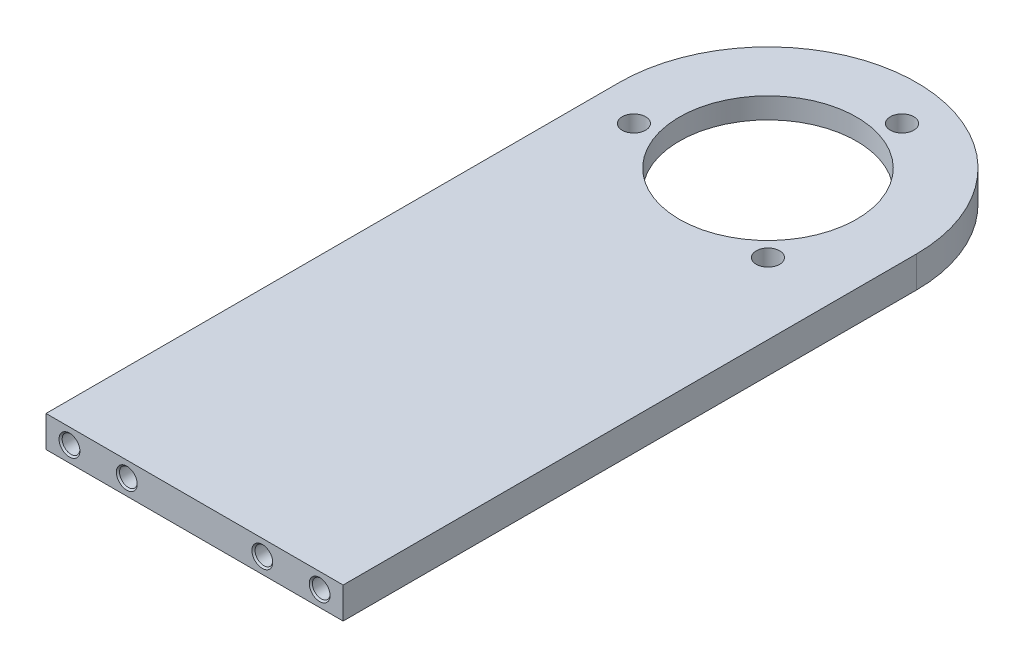
ISO-10303-21;
HEADER;
FILE_DESCRIPTION(('STEP AP214'),'2;1');
FILE_NAME('part.step','',(''),(''),'','','');
FILE_SCHEMA(('AUTOMOTIVE_DESIGN { 1 0 10303 214 1 1 1 1 }'));
ENDSEC;
DATA;
#1=APPLICATION_CONTEXT('core data for automotive mechanical design processes');
#2=APPLICATION_PROTOCOL_DEFINITION('international standard','automotive_design',2000,#1);
#3=PRODUCT_CONTEXT('',#1,'mechanical');
#4=PRODUCT('Part','Part','',(#3));
#5=PRODUCT_RELATED_PRODUCT_CATEGORY('part','',(#4));
#6=PRODUCT_DEFINITION_FORMATION('','',#4);
#7=PRODUCT_DEFINITION_CONTEXT('part definition',#1,'design');
#8=PRODUCT_DEFINITION('design','',#6,#7);
#9=PRODUCT_DEFINITION_SHAPE('','',#8);
#10=(LENGTH_UNIT() NAMED_UNIT(*) SI_UNIT(.MILLI.,.METRE.));
#11=(NAMED_UNIT(*) PLANE_ANGLE_UNIT() SI_UNIT($,.RADIAN.));
#12=(NAMED_UNIT(*) SI_UNIT($,.STERADIAN.) SOLID_ANGLE_UNIT());
#13=UNCERTAINTY_MEASURE_WITH_UNIT(LENGTH_MEASURE(1.E-05),#10,'distance_accuracy_value','');
#14=(GEOMETRIC_REPRESENTATION_CONTEXT(3) GLOBAL_UNCERTAINTY_ASSIGNED_CONTEXT((#13)) GLOBAL_UNIT_ASSIGNED_CONTEXT((#10,
#11,#12)) REPRESENTATION_CONTEXT('',''));
#15=CARTESIAN_POINT('',(0.,0.,0.));
#16=DIRECTION('',(0.,0.,1.));
#17=DIRECTION('',(1.,0.,0.));
#18=AXIS2_PLACEMENT_3D('',#15,#16,#17);
#19=CARTESIAN_POINT('',(0.,6.,-110.));
#20=DIRECTION('',(0.,-1.,0.));
#21=DIRECTION('',(0.,0.,-1.));
#22=AXIS2_PLACEMENT_3D('',#19,#20,#21);
#23=CYLINDRICAL_SURFACE('',#22,28.5);
#24=CARTESIAN_POINT('',(0.,0.,-110.));
#25=DIRECTION('',(0.,1.,0.));
#26=DIRECTION('',(0.,0.,1.));
#27=AXIS2_PLACEMENT_3D('',#24,#25,#26);
#28=CIRCLE('',#27,28.5);
#29=CARTESIAN_POINT('',(28.5,0.,-110.));
#30=VERTEX_POINT('',#29);
#31=CARTESIAN_POINT('',(-28.5,0.,-110.));
#32=VERTEX_POINT('',#31);
#33=EDGE_CURVE('E154',#30,#32,#28,.T.);
#34=ORIENTED_EDGE('',*,*,#33,.T.);
#35=DIRECTION('',(0.,-1.,0.));
#36=VECTOR('',#35,1.);
#37=CARTESIAN_POINT('',(-28.5,6.,-110.));
#38=LINE('',#37,#36);
#39=CARTESIAN_POINT('',(-28.5,6.,-110.));
#40=VERTEX_POINT('',#39);
#41=EDGE_CURVE('E11',#40,#32,#38,.T.);
#42=ORIENTED_EDGE('',*,*,#41,.F.);
#43=CARTESIAN_POINT('',(0.,6.,-110.));
#44=DIRECTION('',(0.,1.,0.));
#45=DIRECTION('',(0.,0.,1.));
#46=AXIS2_PLACEMENT_3D('',#43,#44,#45);
#47=CIRCLE('',#46,28.5);
#48=CARTESIAN_POINT('',(28.5,6.,-110.));
#49=VERTEX_POINT('',#48);
#50=EDGE_CURVE('E158',#49,#40,#47,.T.);
#51=ORIENTED_EDGE('',*,*,#50,.F.);
#52=DIRECTION('',(0.,-1.,0.));
#53=VECTOR('',#52,1.);
#54=CARTESIAN_POINT('',(28.5,6.,-110.));
#55=LINE('',#54,#53);
#56=EDGE_CURVE('E165',#49,#30,#55,.T.);
#57=ORIENTED_EDGE('',*,*,#56,.T.);
#58=EDGE_LOOP('',(#34,#42,#51,#57));
#59=FACE_BOUND('',#58,.T.);
#60=ADVANCED_FACE('F32',(#59),#23,.T.);
#61=CARTESIAN_POINT('',(-28.5,6.,-110.));
#62=DIRECTION('',(1.,0.,0.));
#63=DIRECTION('',(0.,0.,-1.));
#64=AXIS2_PLACEMENT_3D('',#61,#62,#63);
#65=PLANE('',#64);
#66=DIRECTION('',(0.,0.,1.));
#67=VECTOR('',#66,1.);
#68=CARTESIAN_POINT('',(-28.5,0.,-110.));
#69=LINE('',#68,#67);
#70=CARTESIAN_POINT('',(-28.5,0.,0.));
#71=VERTEX_POINT('',#70);
#72=EDGE_CURVE('E168',#32,#71,#69,.T.);
#73=ORIENTED_EDGE('',*,*,#72,.T.);
#74=DIRECTION('',(0.,-1.,0.));
#75=VECTOR('',#74,1.);
#76=CARTESIAN_POINT('',(-28.5,6.,0.));
#77=LINE('',#76,#75);
#78=CARTESIAN_POINT('',(-28.5,6.,0.));
#79=VERTEX_POINT('',#78);
#80=EDGE_CURVE('E41',#79,#71,#77,.T.);
#81=ORIENTED_EDGE('',*,*,#80,.F.);
#82=DIRECTION('',(0.,0.,1.));
#83=VECTOR('',#82,1.);
#84=CARTESIAN_POINT('',(-28.5,6.,-110.));
#85=LINE('',#84,#83);
#86=EDGE_CURVE('E80',#40,#79,#85,.T.);
#87=ORIENTED_EDGE('',*,*,#86,.F.);
#88=ORIENTED_EDGE('',*,*,#41,.T.);
#89=EDGE_LOOP('',(#73,#81,#87,#88));
#90=FACE_BOUND('',#89,.T.);
#91=ADVANCED_FACE('F218',(#90),#65,.F.);
#92=CARTESIAN_POINT('',(0.,6.,0.));
#93=DIRECTION('',(0.,0.,-1.));
#94=DIRECTION('',(-1.,0.,0.));
#95=AXIS2_PLACEMENT_3D('',#92,#93,#94);
#96=PLANE('',#95);
#97=CARTESIAN_POINT('',(-24.,3.,0.));
#98=DIRECTION('',(0.,0.,1.));
#99=DIRECTION('',(1.,0.,0.));
#100=AXIS2_PLACEMENT_3D('',#97,#98,#99);
#101=CIRCLE('',#100,2.);
#102=CARTESIAN_POINT('',(-22.,3.,0.));
#103=VERTEX_POINT('',#102);
#104=EDGE_CURVE('E110',#103,#103,#101,.T.);
#105=ORIENTED_EDGE('',*,*,#104,.F.);
#106=EDGE_LOOP('',(#105));
#107=FACE_BOUND('',#106,.T.);
#108=CARTESIAN_POINT('',(-13.,3.,0.));
#109=DIRECTION('',(0.,0.,1.));
#110=DIRECTION('',(1.,0.,0.));
#111=AXIS2_PLACEMENT_3D('',#108,#109,#110);
#112=CIRCLE('',#111,2.);
#113=CARTESIAN_POINT('',(-11.,3.,0.));
#114=VERTEX_POINT('',#113);
#115=EDGE_CURVE('E103',#114,#114,#112,.T.);
#116=ORIENTED_EDGE('',*,*,#115,.F.);
#117=EDGE_LOOP('',(#116));
#118=FACE_BOUND('',#117,.T.);
#119=CARTESIAN_POINT('',(13.,3.,0.));
#120=DIRECTION('',(0.,0.,1.));
#121=DIRECTION('',(1.,0.,0.));
#122=AXIS2_PLACEMENT_3D('',#119,#120,#121);
#123=CIRCLE('',#122,2.);
#124=CARTESIAN_POINT('',(15.,3.,0.));
#125=VERTEX_POINT('',#124);
#126=EDGE_CURVE('E119',#125,#125,#123,.T.);
#127=ORIENTED_EDGE('',*,*,#126,.F.);
#128=EDGE_LOOP('',(#127));
#129=FACE_BOUND('',#128,.T.);
#130=CARTESIAN_POINT('',(24.,3.,0.));
#131=DIRECTION('',(0.,0.,1.));
#132=DIRECTION('',(1.,0.,0.));
#133=AXIS2_PLACEMENT_3D('',#130,#131,#132);
#134=CIRCLE('',#133,2.);
#135=CARTESIAN_POINT('',(26.,3.,0.));
#136=VERTEX_POINT('',#135);
#137=EDGE_CURVE('E128',#136,#136,#134,.T.);
#138=ORIENTED_EDGE('',*,*,#137,.F.);
#139=EDGE_LOOP('',(#138));
#140=FACE_BOUND('',#139,.T.);
#141=DIRECTION('',(1.,0.,0.));
#142=VECTOR('',#141,1.);
#143=CARTESIAN_POINT('',(0.,0.,0.));
#144=LINE('',#143,#142);
#145=CARTESIAN_POINT('',(28.5,0.,0.));
#146=VERTEX_POINT('',#145);
#147=EDGE_CURVE('E67',#71,#146,#144,.T.);
#148=ORIENTED_EDGE('',*,*,#147,.T.);
#149=DIRECTION('',(0.,-1.,0.));
#150=VECTOR('',#149,1.);
#151=CARTESIAN_POINT('',(28.5,6.,0.));
#152=LINE('',#151,#150);
#153=CARTESIAN_POINT('',(28.5,6.,0.));
#154=VERTEX_POINT('',#153);
#155=EDGE_CURVE('E174',#154,#146,#152,.T.);
#156=ORIENTED_EDGE('',*,*,#155,.F.);
#157=DIRECTION('',(-1.,0.,0.));
#158=VECTOR('',#157,1.);
#159=CARTESIAN_POINT('',(0.,6.,0.));
#160=LINE('',#159,#158);
#161=EDGE_CURVE('E161',#154,#79,#160,.T.);
#162=ORIENTED_EDGE('',*,*,#161,.T.);
#163=ORIENTED_EDGE('',*,*,#80,.T.);
#164=EDGE_LOOP('',(#148,#156,#162,#163));
#165=FACE_BOUND('',#164,.T.);
#166=ADVANCED_FACE('F217',(#107,#118,#129,#140,#165),#96,.F.);
#167=CARTESIAN_POINT('',(28.5,6.,0.));
#168=DIRECTION('',(-1.,0.,0.));
#169=DIRECTION('',(0.,0.,1.));
#170=AXIS2_PLACEMENT_3D('',#167,#168,#169);
#171=PLANE('',#170);
#172=DIRECTION('',(0.,0.,-1.));
#173=VECTOR('',#172,1.);
#174=CARTESIAN_POINT('',(28.5,0.,0.));
#175=LINE('',#174,#173);
#176=EDGE_CURVE('E73',#146,#30,#175,.T.);
#177=ORIENTED_EDGE('',*,*,#176,.T.);
#178=ORIENTED_EDGE('',*,*,#56,.F.);
#179=DIRECTION('',(0.,0.,-1.));
#180=VECTOR('',#179,1.);
#181=CARTESIAN_POINT('',(28.5,6.,0.));
#182=LINE('',#181,#180);
#183=EDGE_CURVE('E50',#154,#49,#182,.T.);
#184=ORIENTED_EDGE('',*,*,#183,.F.);
#185=ORIENTED_EDGE('',*,*,#155,.T.);
#186=EDGE_LOOP('',(#177,#178,#184,#185));
#187=FACE_BOUND('',#186,.T.);
#188=ADVANCED_FACE('F216',(#187),#171,.F.);
#189=CARTESIAN_POINT('',(0.,6.,-110.));
#190=DIRECTION('',(0.,1.,0.));
#191=DIRECTION('',(0.,0.,1.));
#192=AXIS2_PLACEMENT_3D('',#189,#190,#191);
#193=PLANE('',#192);
#194=CARTESIAN_POINT('',(14.8492424049176,6.,-95.1507575950827));
#195=DIRECTION('',(0.,1.,0.));
#196=DIRECTION('',(0.,0.,1.));
#197=AXIS2_PLACEMENT_3D('',#194,#195,#196);
#198=CIRCLE('',#197,2.25);
#199=CARTESIAN_POINT('',(14.8492424049176,6.,-92.9007575950827));
#200=VERTEX_POINT('',#199);
#201=EDGE_CURVE('E138',#200,#200,#198,.T.);
#202=ORIENTED_EDGE('',*,*,#201,.F.);
#203=EDGE_LOOP('',(#202));
#204=FACE_BOUND('',#203,.T.);
#205=CARTESIAN_POINT('',(-20.2844423520704,6.,-104.564800052847));
#206=DIRECTION('',(0.,1.,0.));
#207=DIRECTION('',(0.,0.,1.));
#208=AXIS2_PLACEMENT_3D('',#205,#206,#207);
#209=CIRCLE('',#208,2.25);
#210=CARTESIAN_POINT('',(-20.2844423520704,6.,-102.314800052847));
#211=VERTEX_POINT('',#210);
#212=EDGE_CURVE('E142',#211,#211,#209,.T.);
#213=ORIENTED_EDGE('',*,*,#212,.F.);
#214=EDGE_LOOP('',(#213));
#215=FACE_BOUND('',#214,.T.);
#216=CARTESIAN_POINT('',(5.43519994715295,6.,-130.28444235207));
#217=DIRECTION('',(0.,1.,0.));
#218=DIRECTION('',(0.,0.,1.));
#219=AXIS2_PLACEMENT_3D('',#216,#217,#218);
#220=CIRCLE('',#219,2.25);
#221=CARTESIAN_POINT('',(5.43519994715295,6.,-128.03444235207));
#222=VERTEX_POINT('',#221);
#223=EDGE_CURVE('E137',#222,#222,#220,.T.);
#224=ORIENTED_EDGE('',*,*,#223,.F.);
#225=EDGE_LOOP('',(#224));
#226=FACE_BOUND('',#225,.T.);
#227=CARTESIAN_POINT('',(0.,6.,-110.));
#228=DIRECTION('',(0.,1.,0.));
#229=DIRECTION('',(0.,0.,1.));
#230=AXIS2_PLACEMENT_3D('',#227,#228,#229);
#231=CIRCLE('',#230,17.);
#232=CARTESIAN_POINT('',(0.,6.,-93.));
#233=VERTEX_POINT('',#232);
#234=EDGE_CURVE('E147',#233,#233,#231,.T.);
#235=ORIENTED_EDGE('',*,*,#234,.F.);
#236=EDGE_LOOP('',(#235));
#237=FACE_BOUND('',#236,.T.);
#238=ORIENTED_EDGE('',*,*,#50,.T.);
#239=ORIENTED_EDGE('',*,*,#86,.T.);
#240=ORIENTED_EDGE('',*,*,#161,.F.);
#241=ORIENTED_EDGE('',*,*,#183,.T.);
#242=EDGE_LOOP('',(#238,#239,#240,#241));
#243=FACE_BOUND('',#242,.T.);
#244=ADVANCED_FACE('F210',(#204,#215,#226,#237,#243),#193,.T.);
#245=CARTESIAN_POINT('',(0.,0.,-110.));
#246=DIRECTION('',(0.,1.,0.));
#247=DIRECTION('',(0.,0.,1.));
#248=AXIS2_PLACEMENT_3D('',#245,#246,#247);
#249=PLANE('',#248);
#250=CARTESIAN_POINT('',(0.,0.,-110.));
#251=DIRECTION('',(0.,1.,0.));
#252=DIRECTION('',(0.,0.,1.));
#253=AXIS2_PLACEMENT_3D('',#250,#251,#252);
#254=CIRCLE('',#253,25.);
#255=CARTESIAN_POINT('',(0.,0.,-85.));
#256=VERTEX_POINT('',#255);
#257=EDGE_CURVE('E155',#256,#256,#254,.T.);
#258=ORIENTED_EDGE('',*,*,#257,.T.);
#259=EDGE_LOOP('',(#258));
#260=FACE_BOUND('',#259,.T.);
#261=ORIENTED_EDGE('',*,*,#33,.F.);
#262=ORIENTED_EDGE('',*,*,#176,.F.);
#263=ORIENTED_EDGE('',*,*,#147,.F.);
#264=ORIENTED_EDGE('',*,*,#72,.F.);
#265=EDGE_LOOP('',(#261,#262,#263,#264));
#266=FACE_BOUND('',#265,.T.);
#267=ADVANCED_FACE('F204',(#260,#266),#249,.F.);
#268=CARTESIAN_POINT('',(0.,2.,-110.));
#269=DIRECTION('',(0.,-1.,0.));
#270=DIRECTION('',(0.,0.,-1.));
#271=AXIS2_PLACEMENT_3D('',#268,#269,#270);
#272=CYLINDRICAL_SURFACE('',#271,25.);
#273=CARTESIAN_POINT('',(0.,2.,-110.));
#274=DIRECTION('',(0.,1.,0.));
#275=DIRECTION('',(0.,0.,1.));
#276=AXIS2_PLACEMENT_3D('',#273,#274,#275);
#277=CIRCLE('',#276,25.);
#278=CARTESIAN_POINT('',(0.,2.,-85.));
#279=VERTEX_POINT('',#278);
#280=EDGE_CURVE('E151',#279,#279,#277,.T.);
#281=ORIENTED_EDGE('',*,*,#280,.T.);
#282=EDGE_LOOP('',(#281));
#283=FACE_BOUND('',#282,.T.);
#284=ORIENTED_EDGE('',*,*,#257,.F.);
#285=EDGE_LOOP('',(#284));
#286=FACE_BOUND('',#285,.T.);
#287=ADVANCED_FACE('F193',(#283,#286),#272,.F.);
#288=CARTESIAN_POINT('',(0.,2.,-110.));
#289=DIRECTION('',(0.,1.,0.));
#290=DIRECTION('',(0.,0.,1.));
#291=AXIS2_PLACEMENT_3D('',#288,#289,#290);
#292=PLANE('',#291);
#293=CARTESIAN_POINT('',(14.8492424049176,2.,-95.1507575950827));
#294=DIRECTION('',(0.,1.,0.));
#295=DIRECTION('',(0.,0.,1.));
#296=AXIS2_PLACEMENT_3D('',#293,#294,#295);
#297=CIRCLE('',#296,2.25);
#298=CARTESIAN_POINT('',(14.8492424049176,2.,-92.9007575950827));
#299=VERTEX_POINT('',#298);
#300=EDGE_CURVE('E35',#299,#299,#297,.F.);
#301=ORIENTED_EDGE('',*,*,#300,.F.);
#302=EDGE_LOOP('',(#301));
#303=FACE_BOUND('',#302,.T.);
#304=CARTESIAN_POINT('',(-20.2844423520704,2.,-104.564800052847));
#305=DIRECTION('',(0.,1.,0.));
#306=DIRECTION('',(0.,0.,1.));
#307=AXIS2_PLACEMENT_3D('',#304,#305,#306);
#308=CIRCLE('',#307,2.25);
#309=CARTESIAN_POINT('',(-20.2844423520704,2.,-102.314800052847));
#310=VERTEX_POINT('',#309);
#311=EDGE_CURVE('E180',#310,#310,#308,.F.);
#312=ORIENTED_EDGE('',*,*,#311,.F.);
#313=EDGE_LOOP('',(#312));
#314=FACE_BOUND('',#313,.T.);
#315=CARTESIAN_POINT('',(5.43519994715295,2.,-130.28444235207));
#316=DIRECTION('',(0.,1.,0.));
#317=DIRECTION('',(0.,0.,1.));
#318=AXIS2_PLACEMENT_3D('',#315,#316,#317);
#319=CIRCLE('',#318,2.25);
#320=CARTESIAN_POINT('',(5.43519994715295,2.,-128.03444235207));
#321=VERTEX_POINT('',#320);
#322=EDGE_CURVE('E141',#321,#321,#319,.F.);
#323=ORIENTED_EDGE('',*,*,#322,.F.);
#324=EDGE_LOOP('',(#323));
#325=FACE_BOUND('',#324,.T.);
#326=CARTESIAN_POINT('',(0.,2.,-110.));
#327=DIRECTION('',(0.,1.,0.));
#328=DIRECTION('',(0.,0.,1.));
#329=AXIS2_PLACEMENT_3D('',#326,#327,#328);
#330=CIRCLE('',#329,17.);
#331=CARTESIAN_POINT('',(0.,2.,-93.));
#332=VERTEX_POINT('',#331);
#333=EDGE_CURVE('E150',#332,#332,#330,.F.);
#334=ORIENTED_EDGE('',*,*,#333,.F.);
#335=EDGE_LOOP('',(#334));
#336=FACE_BOUND('',#335,.T.);
#337=ORIENTED_EDGE('',*,*,#280,.F.);
#338=EDGE_LOOP('',(#337));
#339=FACE_BOUND('',#338,.T.);
#340=ADVANCED_FACE('F189',(#303,#314,#325,#336,#339),#292,.F.);
#341=CARTESIAN_POINT('',(0.,6.,-110.));
#342=DIRECTION('',(0.,-1.,0.));
#343=DIRECTION('',(0.,0.,-1.));
#344=AXIS2_PLACEMENT_3D('',#341,#342,#343);
#345=CYLINDRICAL_SURFACE('',#344,17.);
#346=ORIENTED_EDGE('',*,*,#234,.T.);
#347=EDGE_LOOP('',(#346));
#348=FACE_BOUND('',#347,.T.);
#349=ORIENTED_EDGE('',*,*,#333,.T.);
#350=EDGE_LOOP('',(#349));
#351=FACE_BOUND('',#350,.T.);
#352=ADVANCED_FACE('F192',(#348,#351),#345,.F.);
#353=CARTESIAN_POINT('',(5.43519994715295,6.,-130.28444235207));
#354=DIRECTION('',(0.,-1.,0.));
#355=DIRECTION('',(0.,0.,-1.));
#356=AXIS2_PLACEMENT_3D('',#353,#354,#355);
#357=CYLINDRICAL_SURFACE('',#356,2.25);
#358=ORIENTED_EDGE('',*,*,#223,.T.);
#359=EDGE_LOOP('',(#358));
#360=FACE_BOUND('',#359,.T.);
#361=ORIENTED_EDGE('',*,*,#322,.T.);
#362=EDGE_LOOP('',(#361));
#363=FACE_BOUND('',#362,.T.);
#364=ADVANCED_FACE('F234',(#360,#363),#357,.F.);
#365=CARTESIAN_POINT('',(-20.2844423520704,6.,-104.564800052847));
#366=DIRECTION('',(0.,-1.,0.));
#367=DIRECTION('',(0.,0.,-1.));
#368=AXIS2_PLACEMENT_3D('',#365,#366,#367);
#369=CYLINDRICAL_SURFACE('',#368,2.25);
#370=ORIENTED_EDGE('',*,*,#212,.T.);
#371=EDGE_LOOP('',(#370));
#372=FACE_BOUND('',#371,.T.);
#373=ORIENTED_EDGE('',*,*,#311,.T.);
#374=EDGE_LOOP('',(#373));
#375=FACE_BOUND('',#374,.T.);
#376=ADVANCED_FACE('F238',(#372,#375),#369,.F.);
#377=CARTESIAN_POINT('',(14.8492424049176,6.,-95.1507575950827));
#378=DIRECTION('',(0.,-1.,0.));
#379=DIRECTION('',(0.,0.,-1.));
#380=AXIS2_PLACEMENT_3D('',#377,#378,#379);
#381=CYLINDRICAL_SURFACE('',#380,2.25);
#382=ORIENTED_EDGE('',*,*,#201,.T.);
#383=EDGE_LOOP('',(#382));
#384=FACE_BOUND('',#383,.T.);
#385=ORIENTED_EDGE('',*,*,#300,.T.);
#386=EDGE_LOOP('',(#385));
#387=FACE_BOUND('',#386,.T.);
#388=ADVANCED_FACE('F187',(#384,#387),#381,.F.);
#389=CARTESIAN_POINT('',(24.,3.,-9.99999999999999));
#390=DIRECTION('',(0.,0.,1.));
#391=DIRECTION('',(1.,0.,0.));
#392=AXIS2_PLACEMENT_3D('',#389,#390,#391);
#393=CONICAL_SURFACE('',#392,1.69999999999999,1.02974425867665);
#394=CARTESIAN_POINT('',(24.,3.,-11.0214630523468));
#395=VERTEX_POINT('',#394);
#396=VERTEX_LOOP('',#395);
#397=FACE_BOUND('',#396,.T.);
#398=CARTESIAN_POINT('',(24.,3.,-9.99999999999999));
#399=DIRECTION('',(0.,0.,1.));
#400=DIRECTION('',(1.,0.,0.));
#401=AXIS2_PLACEMENT_3D('',#398,#399,#400);
#402=CIRCLE('',#401,1.69999999999999);
#403=CARTESIAN_POINT('',(25.7,3.,-9.99999999999999));
#404=VERTEX_POINT('',#403);
#405=EDGE_CURVE('E134',#404,#404,#402,.T.);
#406=ORIENTED_EDGE('',*,*,#405,.T.);
#407=EDGE_LOOP('',(#406));
#408=FACE_BOUND('',#407,.T.);
#409=ADVANCED_FACE('F245',(#397,#408),#393,.F.);
#410=CARTESIAN_POINT('',(24.,3.,0.));
#411=DIRECTION('',(0.,0.,1.));
#412=DIRECTION('',(1.,0.,0.));
#413=AXIS2_PLACEMENT_3D('',#410,#411,#412);
#414=CYLINDRICAL_SURFACE('',#413,1.69999999999999);
#415=ORIENTED_EDGE('',*,*,#405,.F.);
#416=EDGE_LOOP('',(#415));
#417=FACE_BOUND('',#416,.T.);
#418=CARTESIAN_POINT('',(24.,3.,-0.3));
#419=DIRECTION('',(0.,0.,1.));
#420=DIRECTION('',(1.,0.,0.));
#421=AXIS2_PLACEMENT_3D('',#418,#419,#420);
#422=CIRCLE('',#421,1.7);
#423=CARTESIAN_POINT('',(25.7,3.,-0.3));
#424=VERTEX_POINT('',#423);
#425=EDGE_CURVE('E131',#424,#424,#422,.T.);
#426=ORIENTED_EDGE('',*,*,#425,.T.);
#427=EDGE_LOOP('',(#426));
#428=FACE_BOUND('',#427,.T.);
#429=ADVANCED_FACE('F249',(#417,#428),#414,.F.);
#430=CARTESIAN_POINT('',(24.,3.,0.));
#431=DIRECTION('',(0.,0.,1.));
#432=DIRECTION('',(1.,0.,0.));
#433=AXIS2_PLACEMENT_3D('',#430,#431,#432);
#434=CONICAL_SURFACE('',#433,2.,0.785398163397448);
#435=ORIENTED_EDGE('',*,*,#425,.F.);
#436=EDGE_LOOP('',(#435));
#437=FACE_BOUND('',#436,.T.);
#438=ORIENTED_EDGE('',*,*,#137,.T.);
#439=EDGE_LOOP('',(#438));
#440=FACE_BOUND('',#439,.T.);
#441=ADVANCED_FACE('F253',(#437,#440),#434,.F.);
#442=CARTESIAN_POINT('',(13.,3.,-9.99999999999999));
#443=DIRECTION('',(0.,0.,1.));
#444=DIRECTION('',(1.,0.,0.));
#445=AXIS2_PLACEMENT_3D('',#442,#443,#444);
#446=CONICAL_SURFACE('',#445,1.69999999999999,1.02974425867665);
#447=CARTESIAN_POINT('',(13.,3.,-11.0214630523468));
#448=VERTEX_POINT('',#447);
#449=VERTEX_LOOP('',#448);
#450=FACE_BOUND('',#449,.T.);
#451=CARTESIAN_POINT('',(13.,3.,-9.99999999999999));
#452=DIRECTION('',(0.,0.,1.));
#453=DIRECTION('',(1.,0.,0.));
#454=AXIS2_PLACEMENT_3D('',#451,#452,#453);
#455=CIRCLE('',#454,1.69999999999999);
#456=CARTESIAN_POINT('',(14.7,3.,-9.99999999999999));
#457=VERTEX_POINT('',#456);
#458=EDGE_CURVE('E125',#457,#457,#455,.T.);
#459=ORIENTED_EDGE('',*,*,#458,.T.);
#460=EDGE_LOOP('',(#459));
#461=FACE_BOUND('',#460,.T.);
#462=ADVANCED_FACE('F257',(#450,#461),#446,.F.);
#463=CARTESIAN_POINT('',(13.,3.,0.));
#464=DIRECTION('',(0.,0.,1.));
#465=DIRECTION('',(1.,0.,0.));
#466=AXIS2_PLACEMENT_3D('',#463,#464,#465);
#467=CYLINDRICAL_SURFACE('',#466,1.69999999999999);
#468=ORIENTED_EDGE('',*,*,#458,.F.);
#469=EDGE_LOOP('',(#468));
#470=FACE_BOUND('',#469,.T.);
#471=CARTESIAN_POINT('',(13.,3.,-0.3));
#472=DIRECTION('',(0.,0.,1.));
#473=DIRECTION('',(1.,0.,0.));
#474=AXIS2_PLACEMENT_3D('',#471,#472,#473);
#475=CIRCLE('',#474,1.7);
#476=CARTESIAN_POINT('',(14.7,3.,-0.3));
#477=VERTEX_POINT('',#476);
#478=EDGE_CURVE('E122',#477,#477,#475,.T.);
#479=ORIENTED_EDGE('',*,*,#478,.T.);
#480=EDGE_LOOP('',(#479));
#481=FACE_BOUND('',#480,.T.);
#482=ADVANCED_FACE('F261',(#470,#481),#467,.F.);
#483=CARTESIAN_POINT('',(13.,3.,0.));
#484=DIRECTION('',(0.,0.,1.));
#485=DIRECTION('',(1.,0.,0.));
#486=AXIS2_PLACEMENT_3D('',#483,#484,#485);
#487=CONICAL_SURFACE('',#486,2.,0.785398163397448);
#488=ORIENTED_EDGE('',*,*,#478,.F.);
#489=EDGE_LOOP('',(#488));
#490=FACE_BOUND('',#489,.T.);
#491=ORIENTED_EDGE('',*,*,#126,.T.);
#492=EDGE_LOOP('',(#491));
#493=FACE_BOUND('',#492,.T.);
#494=ADVANCED_FACE('F265',(#490,#493),#487,.F.);
#495=CARTESIAN_POINT('',(-13.,3.,-9.99999999999999));
#496=DIRECTION('',(0.,0.,1.));
#497=DIRECTION('',(1.,0.,0.));
#498=AXIS2_PLACEMENT_3D('',#495,#496,#497);
#499=CONICAL_SURFACE('',#498,1.69999999999999,1.02974425867665);
#500=CARTESIAN_POINT('',(-13.,3.,-11.0214630523468));
#501=VERTEX_POINT('',#500);
#502=VERTEX_LOOP('',#501);
#503=FACE_BOUND('',#502,.T.);
#504=CARTESIAN_POINT('',(-13.,3.,-9.99999999999999));
#505=DIRECTION('',(0.,0.,1.));
#506=DIRECTION('',(1.,0.,0.));
#507=AXIS2_PLACEMENT_3D('',#504,#505,#506);
#508=CIRCLE('',#507,1.69999999999999);
#509=CARTESIAN_POINT('',(-11.3,3.,-9.99999999999999));
#510=VERTEX_POINT('',#509);
#511=EDGE_CURVE('E116',#510,#510,#508,.T.);
#512=ORIENTED_EDGE('',*,*,#511,.T.);
#513=EDGE_LOOP('',(#512));
#514=FACE_BOUND('',#513,.T.);
#515=ADVANCED_FACE('F269',(#503,#514),#499,.F.);
#516=CARTESIAN_POINT('',(-13.,3.,0.));
#517=DIRECTION('',(0.,0.,1.));
#518=DIRECTION('',(1.,0.,0.));
#519=AXIS2_PLACEMENT_3D('',#516,#517,#518);
#520=CYLINDRICAL_SURFACE('',#519,1.69999999999999);
#521=ORIENTED_EDGE('',*,*,#511,.F.);
#522=EDGE_LOOP('',(#521));
#523=FACE_BOUND('',#522,.T.);
#524=CARTESIAN_POINT('',(-13.,3.,-0.3));
#525=DIRECTION('',(0.,0.,1.));
#526=DIRECTION('',(1.,0.,0.));
#527=AXIS2_PLACEMENT_3D('',#524,#525,#526);
#528=CIRCLE('',#527,1.7);
#529=CARTESIAN_POINT('',(-11.3,3.,-0.3));
#530=VERTEX_POINT('',#529);
#531=EDGE_CURVE('E107',#530,#530,#528,.T.);
#532=ORIENTED_EDGE('',*,*,#531,.T.);
#533=EDGE_LOOP('',(#532));
#534=FACE_BOUND('',#533,.T.);
#535=ADVANCED_FACE('F273',(#523,#534),#520,.F.);
#536=CARTESIAN_POINT('',(-13.,3.,0.));
#537=DIRECTION('',(0.,0.,1.));
#538=DIRECTION('',(1.,0.,0.));
#539=AXIS2_PLACEMENT_3D('',#536,#537,#538);
#540=CONICAL_SURFACE('',#539,2.,0.785398163397448);
#541=ORIENTED_EDGE('',*,*,#531,.F.);
#542=EDGE_LOOP('',(#541));
#543=FACE_BOUND('',#542,.T.);
#544=ORIENTED_EDGE('',*,*,#115,.T.);
#545=EDGE_LOOP('',(#544));
#546=FACE_BOUND('',#545,.T.);
#547=ADVANCED_FACE('F97',(#543,#546),#540,.F.);
#548=CARTESIAN_POINT('',(-24.,3.,-9.99999999999999));
#549=DIRECTION('',(0.,0.,1.));
#550=DIRECTION('',(1.,0.,0.));
#551=AXIS2_PLACEMENT_3D('',#548,#549,#550);
#552=CONICAL_SURFACE('',#551,1.69999999999999,1.02974425867665);
#553=CARTESIAN_POINT('',(-24.,3.,-11.0214630523468));
#554=VERTEX_POINT('',#553);
#555=VERTEX_LOOP('',#554);
#556=FACE_BOUND('',#555,.T.);
#557=CARTESIAN_POINT('',(-24.,3.,-9.99999999999999));
#558=DIRECTION('',(0.,0.,1.));
#559=DIRECTION('',(1.,0.,0.));
#560=AXIS2_PLACEMENT_3D('',#557,#558,#559);
#561=CIRCLE('',#560,1.69999999999999);
#562=CARTESIAN_POINT('',(-22.3,3.,-9.99999999999999));
#563=VERTEX_POINT('',#562);
#564=EDGE_CURVE('E101',#563,#563,#561,.T.);
#565=ORIENTED_EDGE('',*,*,#564,.T.);
#566=EDGE_LOOP('',(#565));
#567=FACE_BOUND('',#566,.T.);
#568=ADVANCED_FACE('F93',(#556,#567),#552,.F.);
#569=CARTESIAN_POINT('',(-24.,3.,0.));
#570=DIRECTION('',(0.,0.,1.));
#571=DIRECTION('',(1.,0.,0.));
#572=AXIS2_PLACEMENT_3D('',#569,#570,#571);
#573=CYLINDRICAL_SURFACE('',#572,1.69999999999999);
#574=ORIENTED_EDGE('',*,*,#564,.F.);
#575=EDGE_LOOP('',(#574));
#576=FACE_BOUND('',#575,.T.);
#577=CARTESIAN_POINT('',(-24.,3.,-0.3));
#578=DIRECTION('',(0.,0.,1.));
#579=DIRECTION('',(1.,0.,0.));
#580=AXIS2_PLACEMENT_3D('',#577,#578,#579);
#581=CIRCLE('',#580,1.7);
#582=CARTESIAN_POINT('',(-22.3,3.,-0.3));
#583=VERTEX_POINT('',#582);
#584=EDGE_CURVE('E104',#583,#583,#581,.T.);
#585=ORIENTED_EDGE('',*,*,#584,.T.);
#586=EDGE_LOOP('',(#585));
#587=FACE_BOUND('',#586,.T.);
#588=ADVANCED_FACE('F96',(#576,#587),#573,.F.);
#589=CARTESIAN_POINT('',(-24.,3.,0.));
#590=DIRECTION('',(0.,0.,1.));
#591=DIRECTION('',(1.,0.,0.));
#592=AXIS2_PLACEMENT_3D('',#589,#590,#591);
#593=CONICAL_SURFACE('',#592,2.,0.785398163397448);
#594=ORIENTED_EDGE('',*,*,#584,.F.);
#595=EDGE_LOOP('',(#594));
#596=FACE_BOUND('',#595,.T.);
#597=ORIENTED_EDGE('',*,*,#104,.T.);
#598=EDGE_LOOP('',(#597));
#599=FACE_BOUND('',#598,.T.);
#600=ADVANCED_FACE('F283',(#596,#599),#593,.F.);
#601=CLOSED_SHELL('',(#60,#91,#166,#188,#244,#267,#287,#340,#352,#364,#376,#388,#409,#429,#441,
#462,#482,#494,#515,#535,#547,#568,#588,#600));
#602=MANIFOLD_SOLID_BREP('B2',#601);
#603=ADVANCED_BREP_SHAPE_REPRESENTATION('',(#18,#602),#14);
#604=SHAPE_DEFINITION_REPRESENTATION(#9,#603);
ENDSEC;
END-ISO-10303-21;
